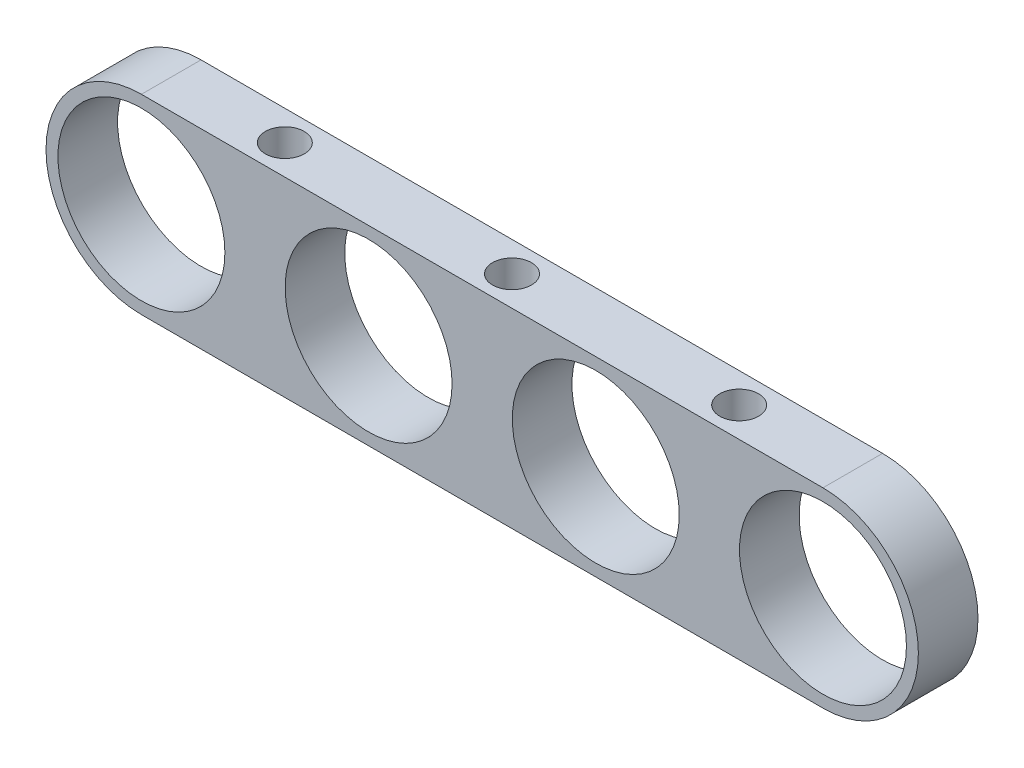
ISO-10303-21;
HEADER;
FILE_DESCRIPTION(('STEP AP214'),'2;1');
FILE_NAME('part.step','',(''),(''),'','','');
FILE_SCHEMA(('AUTOMOTIVE_DESIGN { 1 0 10303 214 1 1 1 1 }'));
ENDSEC;
DATA;
#1=APPLICATION_CONTEXT('core data for automotive mechanical design processes');
#2=APPLICATION_PROTOCOL_DEFINITION('international standard','automotive_design',2000,#1);
#3=PRODUCT_CONTEXT('',#1,'mechanical');
#4=PRODUCT('Part','Part','',(#3));
#5=PRODUCT_RELATED_PRODUCT_CATEGORY('part','',(#4));
#6=PRODUCT_DEFINITION_FORMATION('','',#4);
#7=PRODUCT_DEFINITION_CONTEXT('part definition',#1,'design');
#8=PRODUCT_DEFINITION('design','',#6,#7);
#9=PRODUCT_DEFINITION_SHAPE('','',#8);
#10=(LENGTH_UNIT() NAMED_UNIT(*) SI_UNIT(.MILLI.,.METRE.));
#11=(NAMED_UNIT(*) PLANE_ANGLE_UNIT() SI_UNIT($,.RADIAN.));
#12=(NAMED_UNIT(*) SI_UNIT($,.STERADIAN.) SOLID_ANGLE_UNIT());
#13=UNCERTAINTY_MEASURE_WITH_UNIT(LENGTH_MEASURE(1.E-05),#10,'distance_accuracy_value','');
#14=(GEOMETRIC_REPRESENTATION_CONTEXT(3) GLOBAL_UNCERTAINTY_ASSIGNED_CONTEXT((#13)) GLOBAL_UNIT_ASSIGNED_CONTEXT((#10,
#11,#12)) REPRESENTATION_CONTEXT('',''));
#15=CARTESIAN_POINT('',(0.,0.,0.));
#16=DIRECTION('',(0.,0.,1.));
#17=DIRECTION('',(1.,0.,0.));
#18=AXIS2_PLACEMENT_3D('',#15,#16,#17);
#19=CARTESIAN_POINT('',(0.,0.,10.));
#20=DIRECTION('',(0.,0.,1.));
#21=DIRECTION('',(1.,0.,0.));
#22=AXIS2_PLACEMENT_3D('',#19,#20,#21);
#23=PLANE('',#22);
#24=CARTESIAN_POINT('',(76.2,0.,10.));
#25=DIRECTION('',(0.,0.,1.));
#26=DIRECTION('',(1.,0.,0.));
#27=AXIS2_PLACEMENT_3D('',#24,#25,#26);
#28=CIRCLE('',#27,14.);
#29=CARTESIAN_POINT('',(90.2,0.,10.));
#30=VERTEX_POINT('',#29);
#31=EDGE_CURVE('E229',#30,#30,#28,.T.);
#32=ORIENTED_EDGE('',*,*,#31,.F.);
#33=EDGE_LOOP('',(#32));
#34=FACE_BOUND('',#33,.T.);
#35=CARTESIAN_POINT('',(0.,0.,10.));
#36=DIRECTION('',(0.,0.,1.));
#37=DIRECTION('',(1.,0.,0.));
#38=AXIS2_PLACEMENT_3D('',#35,#36,#37);
#39=CIRCLE('',#38,14.);
#40=CARTESIAN_POINT('',(14.,0.,10.));
#41=VERTEX_POINT('',#40);
#42=EDGE_CURVE('E105',#41,#41,#39,.T.);
#43=ORIENTED_EDGE('',*,*,#42,.F.);
#44=EDGE_LOOP('',(#43));
#45=FACE_BOUND('',#44,.T.);
#46=CARTESIAN_POINT('',(0.,0.,10.));
#47=DIRECTION('',(0.,0.,1.));
#48=DIRECTION('',(1.,0.,0.));
#49=AXIS2_PLACEMENT_3D('',#46,#47,#48);
#50=CIRCLE('',#49,16.);
#51=CARTESIAN_POINT('',(0.,16.,10.));
#52=VERTEX_POINT('',#51);
#53=CARTESIAN_POINT('',(0.,-16.,10.));
#54=VERTEX_POINT('',#53);
#55=EDGE_CURVE('E86',#52,#54,#50,.T.);
#56=ORIENTED_EDGE('',*,*,#55,.T.);
#57=DIRECTION('',(1.,0.,0.));
#58=VECTOR('',#57,1.);
#59=CARTESIAN_POINT('',(0.,-16.,10.));
#60=LINE('',#59,#58);
#61=CARTESIAN_POINT('',(114.3,-16.,10.));
#62=VERTEX_POINT('',#61);
#63=EDGE_CURVE('E81',#54,#62,#60,.T.);
#64=ORIENTED_EDGE('',*,*,#63,.T.);
#65=CARTESIAN_POINT('',(114.3,0.,10.));
#66=DIRECTION('',(0.,0.,1.));
#67=DIRECTION('',(1.,0.,0.));
#68=AXIS2_PLACEMENT_3D('',#65,#66,#67);
#69=CIRCLE('',#68,16.);
#70=CARTESIAN_POINT('',(114.3,16.,10.));
#71=VERTEX_POINT('',#70);
#72=EDGE_CURVE('E84',#62,#71,#69,.T.);
#73=ORIENTED_EDGE('',*,*,#72,.T.);
#74=DIRECTION('',(-1.,0.,0.));
#75=VECTOR('',#74,1.);
#76=CARTESIAN_POINT('',(0.,16.,10.));
#77=LINE('',#76,#75);
#78=EDGE_CURVE('E50',#71,#52,#77,.T.);
#79=ORIENTED_EDGE('',*,*,#78,.T.);
#80=EDGE_LOOP('',(#56,#64,#73,#79));
#81=FACE_BOUND('',#80,.T.);
#82=CARTESIAN_POINT('',(38.1,0.,10.));
#83=DIRECTION('',(0.,0.,1.));
#84=DIRECTION('',(1.,0.,0.));
#85=AXIS2_PLACEMENT_3D('',#82,#83,#84);
#86=CIRCLE('',#85,14.);
#87=CARTESIAN_POINT('',(52.1,0.,10.));
#88=VERTEX_POINT('',#87);
#89=EDGE_CURVE('E235',#88,#88,#86,.T.);
#90=ORIENTED_EDGE('',*,*,#89,.F.);
#91=EDGE_LOOP('',(#90));
#92=FACE_BOUND('',#91,.T.);
#93=CARTESIAN_POINT('',(114.3,0.,10.));
#94=DIRECTION('',(0.,0.,1.));
#95=DIRECTION('',(1.,0.,0.));
#96=AXIS2_PLACEMENT_3D('',#93,#94,#95);
#97=CIRCLE('',#96,14.);
#98=CARTESIAN_POINT('',(128.3,0.,10.));
#99=VERTEX_POINT('',#98);
#100=EDGE_CURVE('E223',#99,#99,#97,.T.);
#101=ORIENTED_EDGE('',*,*,#100,.F.);
#102=EDGE_LOOP('',(#101));
#103=FACE_BOUND('',#102,.T.);
#104=ADVANCED_FACE('F33',(#34,#45,#81,#92,#103),#23,.T.);
#105=CARTESIAN_POINT('',(0.,0.,0.));
#106=DIRECTION('',(0.,0.,1.));
#107=DIRECTION('',(1.,0.,0.));
#108=AXIS2_PLACEMENT_3D('',#105,#106,#107);
#109=PLANE('',#108);
#110=CARTESIAN_POINT('',(0.,0.,0.));
#111=DIRECTION('',(0.,0.,1.));
#112=DIRECTION('',(1.,0.,0.));
#113=AXIS2_PLACEMENT_3D('',#110,#111,#112);
#114=CIRCLE('',#113,16.);
#115=CARTESIAN_POINT('',(0.,16.,0.));
#116=VERTEX_POINT('',#115);
#117=CARTESIAN_POINT('',(0.,-16.,0.));
#118=VERTEX_POINT('',#117);
#119=EDGE_CURVE('E102',#116,#118,#114,.T.);
#120=ORIENTED_EDGE('',*,*,#119,.F.);
#121=DIRECTION('',(-1.,0.,0.));
#122=VECTOR('',#121,1.);
#123=CARTESIAN_POINT('',(0.,16.,0.));
#124=LINE('',#123,#122);
#125=CARTESIAN_POINT('',(114.3,16.,0.));
#126=VERTEX_POINT('',#125);
#127=EDGE_CURVE('E73',#126,#116,#124,.T.);
#128=ORIENTED_EDGE('',*,*,#127,.F.);
#129=CARTESIAN_POINT('',(114.3,0.,0.));
#130=DIRECTION('',(0.,0.,1.));
#131=DIRECTION('',(1.,0.,0.));
#132=AXIS2_PLACEMENT_3D('',#129,#130,#131);
#133=CIRCLE('',#132,16.);
#134=CARTESIAN_POINT('',(114.3,-16.,0.));
#135=VERTEX_POINT('',#134);
#136=EDGE_CURVE('E67',#135,#126,#133,.T.);
#137=ORIENTED_EDGE('',*,*,#136,.F.);
#138=DIRECTION('',(1.,0.,0.));
#139=VECTOR('',#138,1.);
#140=CARTESIAN_POINT('',(0.,-16.,0.));
#141=LINE('',#140,#139);
#142=EDGE_CURVE('E92',#118,#135,#141,.T.);
#143=ORIENTED_EDGE('',*,*,#142,.F.);
#144=EDGE_LOOP('',(#120,#128,#137,#143));
#145=FACE_BOUND('',#144,.T.);
#146=CARTESIAN_POINT('',(0.,0.,0.));
#147=DIRECTION('',(0.,0.,1.));
#148=DIRECTION('',(1.,0.,0.));
#149=AXIS2_PLACEMENT_3D('',#146,#147,#148);
#150=CIRCLE('',#149,14.);
#151=CARTESIAN_POINT('',(14.,0.,0.));
#152=VERTEX_POINT('',#151);
#153=EDGE_CURVE('E238',#152,#152,#150,.T.);
#154=ORIENTED_EDGE('',*,*,#153,.T.);
#155=EDGE_LOOP('',(#154));
#156=FACE_BOUND('',#155,.T.);
#157=CARTESIAN_POINT('',(38.1,0.,0.));
#158=DIRECTION('',(0.,0.,1.));
#159=DIRECTION('',(1.,0.,0.));
#160=AXIS2_PLACEMENT_3D('',#157,#158,#159);
#161=CIRCLE('',#160,14.);
#162=CARTESIAN_POINT('',(52.1,0.,0.));
#163=VERTEX_POINT('',#162);
#164=EDGE_CURVE('E232',#163,#163,#161,.T.);
#165=ORIENTED_EDGE('',*,*,#164,.T.);
#166=EDGE_LOOP('',(#165));
#167=FACE_BOUND('',#166,.T.);
#168=CARTESIAN_POINT('',(76.2,0.,0.));
#169=DIRECTION('',(0.,0.,1.));
#170=DIRECTION('',(1.,0.,0.));
#171=AXIS2_PLACEMENT_3D('',#168,#169,#170);
#172=CIRCLE('',#171,14.);
#173=CARTESIAN_POINT('',(90.2,0.,0.));
#174=VERTEX_POINT('',#173);
#175=EDGE_CURVE('E226',#174,#174,#172,.T.);
#176=ORIENTED_EDGE('',*,*,#175,.T.);
#177=EDGE_LOOP('',(#176));
#178=FACE_BOUND('',#177,.T.);
#179=CARTESIAN_POINT('',(114.3,0.,0.));
#180=DIRECTION('',(0.,0.,1.));
#181=DIRECTION('',(1.,0.,0.));
#182=AXIS2_PLACEMENT_3D('',#179,#180,#181);
#183=CIRCLE('',#182,14.);
#184=CARTESIAN_POINT('',(128.3,0.,0.));
#185=VERTEX_POINT('',#184);
#186=EDGE_CURVE('E220',#185,#185,#183,.T.);
#187=ORIENTED_EDGE('',*,*,#186,.T.);
#188=EDGE_LOOP('',(#187));
#189=FACE_BOUND('',#188,.T.);
#190=ADVANCED_FACE('F145',(#145,#156,#167,#178,#189),#109,.F.);
#191=CARTESIAN_POINT('',(0.,0.,10.));
#192=DIRECTION('',(0.,0.,-1.));
#193=DIRECTION('',(-1.,0.,0.));
#194=AXIS2_PLACEMENT_3D('',#191,#192,#193);
#195=CYLINDRICAL_SURFACE('',#194,16.);
#196=ORIENTED_EDGE('',*,*,#119,.T.);
#197=DIRECTION('',(0.,0.,-1.));
#198=VECTOR('',#197,1.);
#199=CARTESIAN_POINT('',(0.,-16.,10.));
#200=LINE('',#199,#198);
#201=EDGE_CURVE('E93',#54,#118,#200,.T.);
#202=ORIENTED_EDGE('',*,*,#201,.F.);
#203=ORIENTED_EDGE('',*,*,#55,.F.);
#204=DIRECTION('',(0.,0.,-1.));
#205=VECTOR('',#204,1.);
#206=CARTESIAN_POINT('',(0.,16.,10.));
#207=LINE('',#206,#205);
#208=EDGE_CURVE('E98',#52,#116,#207,.T.);
#209=ORIENTED_EDGE('',*,*,#208,.T.);
#210=EDGE_LOOP('',(#196,#202,#203,#209));
#211=FACE_BOUND('',#210,.T.);
#212=ADVANCED_FACE('F151',(#211),#195,.T.);
#213=CARTESIAN_POINT('',(0.,-16.,10.));
#214=DIRECTION('',(0.,1.,0.));
#215=DIRECTION('',(0.,0.,1.));
#216=AXIS2_PLACEMENT_3D('',#213,#214,#215);
#217=PLANE('',#216);
#218=CARTESIAN_POINT('',(57.15,-16.,5.));
#219=DIRECTION('',(0.,1.,0.));
#220=DIRECTION('',(0.,0.,1.));
#221=AXIS2_PLACEMENT_3D('',#218,#219,#220);
#222=CIRCLE('',#221,1.5875);
#223=CARTESIAN_POINT('',(57.15,-16.,6.5875));
#224=VERTEX_POINT('',#223);
#225=EDGE_CURVE('E197',#224,#224,#222,.T.);
#226=ORIENTED_EDGE('',*,*,#225,.T.);
#227=EDGE_LOOP('',(#226));
#228=FACE_BOUND('',#227,.T.);
#229=CARTESIAN_POINT('',(19.05,-16.,5.));
#230=DIRECTION('',(0.,1.,0.));
#231=DIRECTION('',(0.,0.,1.));
#232=AXIS2_PLACEMENT_3D('',#229,#230,#231);
#233=CIRCLE('',#232,1.5875);
#234=CARTESIAN_POINT('',(19.05,-16.,6.5875));
#235=VERTEX_POINT('',#234);
#236=EDGE_CURVE('E211',#235,#235,#233,.T.);
#237=ORIENTED_EDGE('',*,*,#236,.T.);
#238=EDGE_LOOP('',(#237));
#239=FACE_BOUND('',#238,.T.);
#240=ORIENTED_EDGE('',*,*,#142,.T.);
#241=DIRECTION('',(0.,0.,-1.));
#242=VECTOR('',#241,1.);
#243=CARTESIAN_POINT('',(114.3,-16.,10.));
#244=LINE('',#243,#242);
#245=EDGE_CURVE('E89',#62,#135,#244,.T.);
#246=ORIENTED_EDGE('',*,*,#245,.F.);
#247=ORIENTED_EDGE('',*,*,#63,.F.);
#248=ORIENTED_EDGE('',*,*,#201,.T.);
#249=EDGE_LOOP('',(#240,#246,#247,#248));
#250=FACE_BOUND('',#249,.T.);
#251=CARTESIAN_POINT('',(95.25,-16.,5.));
#252=DIRECTION('',(0.,1.,0.));
#253=DIRECTION('',(0.,0.,1.));
#254=AXIS2_PLACEMENT_3D('',#251,#252,#253);
#255=CIRCLE('',#254,1.5875);
#256=CARTESIAN_POINT('',(95.25,-16.,6.5875));
#257=VERTEX_POINT('',#256);
#258=EDGE_CURVE('E112',#257,#257,#255,.T.);
#259=ORIENTED_EDGE('',*,*,#258,.T.);
#260=EDGE_LOOP('',(#259));
#261=FACE_BOUND('',#260,.T.);
#262=ADVANCED_FACE('F90',(#228,#239,#250,#261),#217,.F.);
#263=CARTESIAN_POINT('',(114.3,0.,10.));
#264=DIRECTION('',(0.,0.,-1.));
#265=DIRECTION('',(-1.,0.,0.));
#266=AXIS2_PLACEMENT_3D('',#263,#264,#265);
#267=CYLINDRICAL_SURFACE('',#266,16.);
#268=ORIENTED_EDGE('',*,*,#136,.T.);
#269=DIRECTION('',(0.,0.,-1.));
#270=VECTOR('',#269,1.);
#271=CARTESIAN_POINT('',(114.3,16.,10.));
#272=LINE('',#271,#270);
#273=EDGE_CURVE('E94',#71,#126,#272,.T.);
#274=ORIENTED_EDGE('',*,*,#273,.F.);
#275=ORIENTED_EDGE('',*,*,#72,.F.);
#276=ORIENTED_EDGE('',*,*,#245,.T.);
#277=EDGE_LOOP('',(#268,#274,#275,#276));
#278=FACE_BOUND('',#277,.T.);
#279=ADVANCED_FACE('F96',(#278),#267,.T.);
#280=CARTESIAN_POINT('',(0.,16.,10.));
#281=DIRECTION('',(0.,-1.,0.));
#282=DIRECTION('',(0.,0.,-1.));
#283=AXIS2_PLACEMENT_3D('',#280,#281,#282);
#284=PLANE('',#283);
#285=CARTESIAN_POINT('',(57.15,16.,5.));
#286=DIRECTION('',(0.,1.,0.));
#287=DIRECTION('',(0.,0.,1.));
#288=AXIS2_PLACEMENT_3D('',#285,#286,#287);
#289=CIRCLE('',#288,3.26342329689666);
#290=CARTESIAN_POINT('',(57.15,16.,8.26342329689666));
#291=VERTEX_POINT('',#290);
#292=EDGE_CURVE('E202',#291,#291,#289,.T.);
#293=ORIENTED_EDGE('',*,*,#292,.F.);
#294=EDGE_LOOP('',(#293));
#295=FACE_BOUND('',#294,.T.);
#296=CARTESIAN_POINT('',(19.05,16.,5.));
#297=DIRECTION('',(0.,1.,0.));
#298=DIRECTION('',(0.,0.,1.));
#299=AXIS2_PLACEMENT_3D('',#296,#297,#298);
#300=CIRCLE('',#299,3.26342329689666);
#301=CARTESIAN_POINT('',(19.05,16.,8.26342329689666));
#302=VERTEX_POINT('',#301);
#303=EDGE_CURVE('E214',#302,#302,#300,.T.);
#304=ORIENTED_EDGE('',*,*,#303,.F.);
#305=EDGE_LOOP('',(#304));
#306=FACE_BOUND('',#305,.T.);
#307=ORIENTED_EDGE('',*,*,#127,.T.);
#308=ORIENTED_EDGE('',*,*,#208,.F.);
#309=ORIENTED_EDGE('',*,*,#78,.F.);
#310=ORIENTED_EDGE('',*,*,#273,.T.);
#311=EDGE_LOOP('',(#307,#308,#309,#310));
#312=FACE_BOUND('',#311,.T.);
#313=CARTESIAN_POINT('',(95.25,16.,5.));
#314=DIRECTION('',(0.,1.,0.));
#315=DIRECTION('',(0.,0.,1.));
#316=AXIS2_PLACEMENT_3D('',#313,#314,#315);
#317=CIRCLE('',#316,3.26342329689666);
#318=CARTESIAN_POINT('',(95.25,16.,8.26342329689666));
#319=VERTEX_POINT('',#318);
#320=EDGE_CURVE('E115',#319,#319,#317,.T.);
#321=ORIENTED_EDGE('',*,*,#320,.F.);
#322=EDGE_LOOP('',(#321));
#323=FACE_BOUND('',#322,.T.);
#324=ADVANCED_FACE('F128',(#295,#306,#312,#323),#284,.F.);
#325=CARTESIAN_POINT('',(0.,0.,10.));
#326=DIRECTION('',(0.,0.,-1.));
#327=DIRECTION('',(-1.,0.,0.));
#328=AXIS2_PLACEMENT_3D('',#325,#326,#327);
#329=CYLINDRICAL_SURFACE('',#328,14.);
#330=ORIENTED_EDGE('',*,*,#42,.T.);
#331=EDGE_LOOP('',(#330));
#332=FACE_BOUND('',#331,.T.);
#333=ORIENTED_EDGE('',*,*,#153,.F.);
#334=EDGE_LOOP('',(#333));
#335=FACE_BOUND('',#334,.T.);
#336=ADVANCED_FACE('F130',(#332,#335),#329,.F.);
#337=CARTESIAN_POINT('',(38.1,0.,10.));
#338=DIRECTION('',(0.,0.,-1.));
#339=DIRECTION('',(-1.,0.,0.));
#340=AXIS2_PLACEMENT_3D('',#337,#338,#339);
#341=CYLINDRICAL_SURFACE('',#340,14.);
#342=ORIENTED_EDGE('',*,*,#89,.T.);
#343=EDGE_LOOP('',(#342));
#344=FACE_BOUND('',#343,.T.);
#345=ORIENTED_EDGE('',*,*,#164,.F.);
#346=EDGE_LOOP('',(#345));
#347=FACE_BOUND('',#346,.T.);
#348=ADVANCED_FACE('F137',(#344,#347),#341,.F.);
#349=CARTESIAN_POINT('',(76.2,0.,10.));
#350=DIRECTION('',(0.,0.,-1.));
#351=DIRECTION('',(-1.,0.,0.));
#352=AXIS2_PLACEMENT_3D('',#349,#350,#351);
#353=CYLINDRICAL_SURFACE('',#352,14.);
#354=ORIENTED_EDGE('',*,*,#31,.T.);
#355=EDGE_LOOP('',(#354));
#356=FACE_BOUND('',#355,.T.);
#357=ORIENTED_EDGE('',*,*,#175,.F.);
#358=EDGE_LOOP('',(#357));
#359=FACE_BOUND('',#358,.T.);
#360=ADVANCED_FACE('F158',(#356,#359),#353,.F.);
#361=CARTESIAN_POINT('',(114.3,0.,10.));
#362=DIRECTION('',(0.,0.,-1.));
#363=DIRECTION('',(-1.,0.,0.));
#364=AXIS2_PLACEMENT_3D('',#361,#362,#363);
#365=CYLINDRICAL_SURFACE('',#364,14.);
#366=ORIENTED_EDGE('',*,*,#100,.T.);
#367=EDGE_LOOP('',(#366));
#368=FACE_BOUND('',#367,.T.);
#369=ORIENTED_EDGE('',*,*,#186,.F.);
#370=EDGE_LOOP('',(#369));
#371=FACE_BOUND('',#370,.T.);
#372=ADVANCED_FACE('F162',(#368,#371),#365,.F.);
#373=CARTESIAN_POINT('',(19.05,6.,5.));
#374=DIRECTION('',(0.,1.,0.));
#375=DIRECTION('',(0.,0.,1.));
#376=AXIS2_PLACEMENT_3D('',#373,#374,#375);
#377=CYLINDRICAL_SURFACE('',#376,3.26342329689666);
#378=CARTESIAN_POINT('',(19.05,6.,5.));
#379=DIRECTION('',(0.,1.,0.));
#380=DIRECTION('',(0.,0.,1.));
#381=AXIS2_PLACEMENT_3D('',#378,#379,#380);
#382=CIRCLE('',#381,3.26342329689666);
#383=CARTESIAN_POINT('',(19.05,6.,8.26342329689666));
#384=VERTEX_POINT('',#383);
#385=EDGE_CURVE('E217',#384,#384,#382,.T.);
#386=ORIENTED_EDGE('',*,*,#385,.F.);
#387=EDGE_LOOP('',(#386));
#388=FACE_BOUND('',#387,.T.);
#389=ORIENTED_EDGE('',*,*,#303,.T.);
#390=EDGE_LOOP('',(#389));
#391=FACE_BOUND('',#390,.T.);
#392=ADVANCED_FACE('F166',(#388,#391),#377,.F.);
#393=CARTESIAN_POINT('',(19.05,6.,5.));
#394=DIRECTION('',(0.,1.,0.));
#395=DIRECTION('',(0.,0.,1.));
#396=AXIS2_PLACEMENT_3D('',#393,#394,#395);
#397=PLANE('',#396);
#398=CARTESIAN_POINT('',(19.05,6.,5.));
#399=DIRECTION('',(0.,1.,0.));
#400=DIRECTION('',(0.,0.,1.));
#401=AXIS2_PLACEMENT_3D('',#398,#399,#400);
#402=CIRCLE('',#401,1.5875);
#403=CARTESIAN_POINT('',(19.05,6.,6.5875));
#404=VERTEX_POINT('',#403);
#405=EDGE_CURVE('E205',#404,#404,#402,.T.);
#406=ORIENTED_EDGE('',*,*,#405,.F.);
#407=EDGE_LOOP('',(#406));
#408=FACE_BOUND('',#407,.T.);
#409=ORIENTED_EDGE('',*,*,#385,.T.);
#410=EDGE_LOOP('',(#409));
#411=FACE_BOUND('',#410,.T.);
#412=ADVANCED_FACE('F170',(#408,#411),#397,.T.);
#413=CARTESIAN_POINT('',(19.05,-16.,5.));
#414=DIRECTION('',(0.,1.,0.));
#415=DIRECTION('',(0.,0.,1.));
#416=AXIS2_PLACEMENT_3D('',#413,#414,#415);
#417=CYLINDRICAL_SURFACE('',#416,1.5875);
#418=ORIENTED_EDGE('',*,*,#236,.F.);
#419=EDGE_LOOP('',(#418));
#420=FACE_BOUND('',#419,.T.);
#421=ORIENTED_EDGE('',*,*,#405,.T.);
#422=EDGE_LOOP('',(#421));
#423=FACE_BOUND('',#422,.T.);
#424=ADVANCED_FACE('F174',(#420,#423),#417,.F.);
#425=CARTESIAN_POINT('',(57.15,6.,5.));
#426=DIRECTION('',(0.,1.,0.));
#427=DIRECTION('',(0.,0.,1.));
#428=AXIS2_PLACEMENT_3D('',#425,#426,#427);
#429=CYLINDRICAL_SURFACE('',#428,3.26342329689666);
#430=CARTESIAN_POINT('',(57.15,6.,5.));
#431=DIRECTION('',(0.,1.,0.));
#432=DIRECTION('',(0.,0.,1.));
#433=AXIS2_PLACEMENT_3D('',#430,#431,#432);
#434=CIRCLE('',#433,3.26342329689666);
#435=CARTESIAN_POINT('',(57.15,6.,8.26342329689666));
#436=VERTEX_POINT('',#435);
#437=EDGE_CURVE('E201',#436,#436,#434,.T.);
#438=ORIENTED_EDGE('',*,*,#437,.F.);
#439=EDGE_LOOP('',(#438));
#440=FACE_BOUND('',#439,.T.);
#441=ORIENTED_EDGE('',*,*,#292,.T.);
#442=EDGE_LOOP('',(#441));
#443=FACE_BOUND('',#442,.T.);
#444=ADVANCED_FACE('F178',(#440,#443),#429,.F.);
#445=CARTESIAN_POINT('',(57.15,6.,5.));
#446=DIRECTION('',(0.,1.,0.));
#447=DIRECTION('',(0.,0.,1.));
#448=AXIS2_PLACEMENT_3D('',#445,#446,#447);
#449=PLANE('',#448);
#450=CARTESIAN_POINT('',(57.15,6.,5.));
#451=DIRECTION('',(0.,1.,0.));
#452=DIRECTION('',(0.,0.,1.));
#453=AXIS2_PLACEMENT_3D('',#450,#451,#452);
#454=CIRCLE('',#453,1.5875);
#455=CARTESIAN_POINT('',(57.15,6.,6.5875));
#456=VERTEX_POINT('',#455);
#457=EDGE_CURVE('E200',#456,#456,#454,.T.);
#458=ORIENTED_EDGE('',*,*,#457,.F.);
#459=EDGE_LOOP('',(#458));
#460=FACE_BOUND('',#459,.T.);
#461=ORIENTED_EDGE('',*,*,#437,.T.);
#462=EDGE_LOOP('',(#461));
#463=FACE_BOUND('',#462,.T.);
#464=ADVANCED_FACE('F182',(#460,#463),#449,.T.);
#465=CARTESIAN_POINT('',(57.15,-16.,5.));
#466=DIRECTION('',(0.,1.,0.));
#467=DIRECTION('',(0.,0.,1.));
#468=AXIS2_PLACEMENT_3D('',#465,#466,#467);
#469=CYLINDRICAL_SURFACE('',#468,1.5875);
#470=ORIENTED_EDGE('',*,*,#225,.F.);
#471=EDGE_LOOP('',(#470));
#472=FACE_BOUND('',#471,.T.);
#473=ORIENTED_EDGE('',*,*,#457,.T.);
#474=EDGE_LOOP('',(#473));
#475=FACE_BOUND('',#474,.T.);
#476=ADVANCED_FACE('F186',(#472,#475),#469,.F.);
#477=CARTESIAN_POINT('',(95.25,-16.,5.));
#478=DIRECTION('',(0.,1.,0.));
#479=DIRECTION('',(0.,0.,1.));
#480=AXIS2_PLACEMENT_3D('',#477,#478,#479);
#481=CYLINDRICAL_SURFACE('',#480,1.5875);
#482=ORIENTED_EDGE('',*,*,#258,.F.);
#483=EDGE_LOOP('',(#482));
#484=FACE_BOUND('',#483,.T.);
#485=CARTESIAN_POINT('',(95.25,6.,5.));
#486=DIRECTION('',(0.,1.,0.));
#487=DIRECTION('',(0.,0.,1.));
#488=AXIS2_PLACEMENT_3D('',#485,#486,#487);
#489=CIRCLE('',#488,1.5875);
#490=CARTESIAN_POINT('',(95.25,6.,6.5875));
#491=VERTEX_POINT('',#490);
#492=EDGE_CURVE('E11',#491,#491,#489,.T.);
#493=ORIENTED_EDGE('',*,*,#492,.T.);
#494=EDGE_LOOP('',(#493));
#495=FACE_BOUND('',#494,.T.);
#496=ADVANCED_FACE('F35',(#484,#495),#481,.F.);
#497=CARTESIAN_POINT('',(95.25,6.,5.));
#498=DIRECTION('',(0.,1.,0.));
#499=DIRECTION('',(0.,0.,1.));
#500=AXIS2_PLACEMENT_3D('',#497,#498,#499);
#501=PLANE('',#500);
#502=ORIENTED_EDGE('',*,*,#492,.F.);
#503=EDGE_LOOP('',(#502));
#504=FACE_BOUND('',#503,.T.);
#505=CARTESIAN_POINT('',(95.25,6.,5.));
#506=DIRECTION('',(0.,1.,0.));
#507=DIRECTION('',(0.,0.,1.));
#508=AXIS2_PLACEMENT_3D('',#505,#506,#507);
#509=CIRCLE('',#508,3.26342329689666);
#510=CARTESIAN_POINT('',(95.25,6.,8.26342329689666));
#511=VERTEX_POINT('',#510);
#512=EDGE_CURVE('E42',#511,#511,#509,.T.);
#513=ORIENTED_EDGE('',*,*,#512,.T.);
#514=EDGE_LOOP('',(#513));
#515=FACE_BOUND('',#514,.T.);
#516=ADVANCED_FACE('F120',(#504,#515),#501,.T.);
#517=CARTESIAN_POINT('',(95.25,6.,5.));
#518=DIRECTION('',(0.,1.,0.));
#519=DIRECTION('',(0.,0.,1.));
#520=AXIS2_PLACEMENT_3D('',#517,#518,#519);
#521=CYLINDRICAL_SURFACE('',#520,3.26342329689666);
#522=ORIENTED_EDGE('',*,*,#512,.F.);
#523=EDGE_LOOP('',(#522));
#524=FACE_BOUND('',#523,.T.);
#525=ORIENTED_EDGE('',*,*,#320,.T.);
#526=EDGE_LOOP('',(#525));
#527=FACE_BOUND('',#526,.T.);
#528=ADVANCED_FACE('F122',(#524,#527),#521,.F.);
#529=CLOSED_SHELL('',(#104,#190,#212,#262,#279,#324,#336,#348,#360,#372,#392,#412,#424,#444,
#464,#476,#496,#516,#528));
#530=MANIFOLD_SOLID_BREP('B2',#529);
#531=ADVANCED_BREP_SHAPE_REPRESENTATION('',(#18,#530),#14);
#532=SHAPE_DEFINITION_REPRESENTATION(#9,#531);
ENDSEC;
END-ISO-10303-21;
